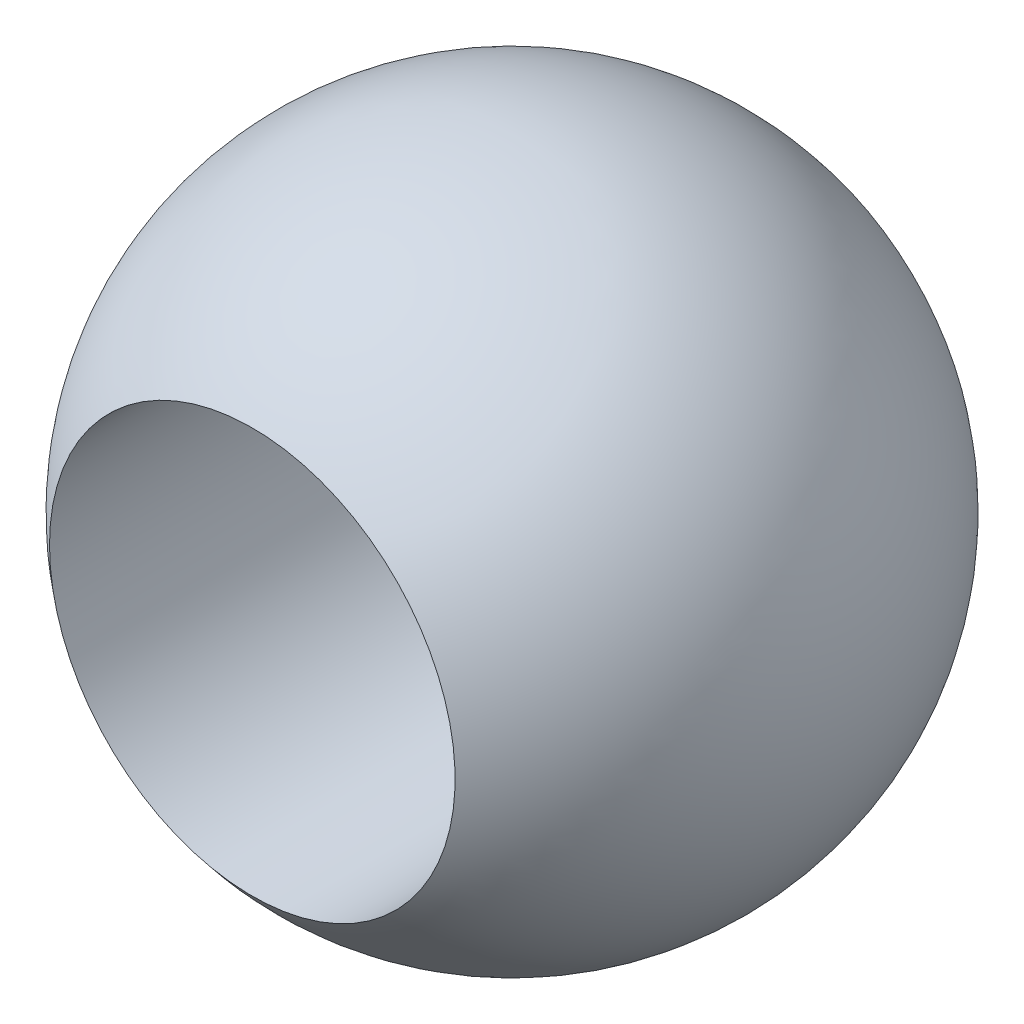
ISO-10303-21;
HEADER;
FILE_DESCRIPTION(('STEP AP214'),'2;1');
FILE_NAME('part.step','',(''),(''),'','','');
FILE_SCHEMA(('AUTOMOTIVE_DESIGN { 1 0 10303 214 1 1 1 1 }'));
ENDSEC;
DATA;
#1=APPLICATION_CONTEXT('core data for automotive mechanical design processes');
#2=APPLICATION_PROTOCOL_DEFINITION('international standard','automotive_design',2000,#1);
#3=PRODUCT_CONTEXT('',#1,'mechanical');
#4=PRODUCT('Part','Part','',(#3));
#5=PRODUCT_RELATED_PRODUCT_CATEGORY('part','',(#4));
#6=PRODUCT_DEFINITION_FORMATION('','',#4);
#7=PRODUCT_DEFINITION_CONTEXT('part definition',#1,'design');
#8=PRODUCT_DEFINITION('design','',#6,#7);
#9=PRODUCT_DEFINITION_SHAPE('','',#8);
#10=(LENGTH_UNIT() NAMED_UNIT(*) SI_UNIT(.MILLI.,.METRE.));
#11=(NAMED_UNIT(*) PLANE_ANGLE_UNIT() SI_UNIT($,.RADIAN.));
#12=(NAMED_UNIT(*) SI_UNIT($,.STERADIAN.) SOLID_ANGLE_UNIT());
#13=UNCERTAINTY_MEASURE_WITH_UNIT(LENGTH_MEASURE(1.E-05),#10,'distance_accuracy_value','');
#14=(GEOMETRIC_REPRESENTATION_CONTEXT(3) GLOBAL_UNCERTAINTY_ASSIGNED_CONTEXT((#13)) GLOBAL_UNIT_ASSIGNED_CONTEXT((#10,
#11,#12)) REPRESENTATION_CONTEXT('',''));
#15=CARTESIAN_POINT('',(0.,0.,0.));
#16=DIRECTION('',(0.,0.,1.));
#17=DIRECTION('',(1.,0.,0.));
#18=AXIS2_PLACEMENT_3D('',#15,#16,#17);
#19=CARTESIAN_POINT('',(0.,0.,0.));
#20=DIRECTION('',(-1.,0.,0.));
#21=DIRECTION('',(0.,1.,0.));
#22=AXIS2_PLACEMENT_3D('',#19,#20,#21);
#23=SPHERICAL_SURFACE('',#22,6.5);
#24=CARTESIAN_POINT('',(0.,0.,0.));
#25=DIRECTION('',(0.,0.,-1.));
#26=DIRECTION('',(-1.,0.,0.));
#27=AXIS2_PLACEMENT_3D('',#24,#25,#26);
#28=SPHERICAL_SURFACE('',#27,6.5);
#29=CARTESIAN_POINT('',(0.,0.,5.1234753829798));
#30=DIRECTION('',(0.,0.,-1.));
#31=DIRECTION('',(-1.,0.,0.));
#32=AXIS2_PLACEMENT_3D('',#29,#30,#31);
#33=CIRCLE('',#32,4.);
#34=CARTESIAN_POINT('',(-4.,0.,5.1234753829798));
#35=VERTEX_POINT('',#34);
#36=EDGE_CURVE('E10',#35,#35,#33,.F.);
#37=ORIENTED_EDGE('',*,*,#36,.F.);
#38=EDGE_LOOP('',(#37));
#39=FACE_BOUND('',#38,.T.);
#40=CARTESIAN_POINT('',(0.,0.,-5.1234753829798));
#41=DIRECTION('',(0.,0.,1.));
#42=DIRECTION('',(1.,0.,0.));
#43=AXIS2_PLACEMENT_3D('',#40,#41,#42);
#44=CIRCLE('',#43,4.);
#45=CARTESIAN_POINT('',(4.,0.,-5.1234753829798));
#46=VERTEX_POINT('',#45);
#47=EDGE_CURVE('E36',#46,#46,#44,.F.);
#48=ORIENTED_EDGE('',*,*,#47,.F.);
#49=EDGE_LOOP('',(#48));
#50=FACE_BOUND('',#49,.T.);
#51=ADVANCED_FACE('F30',(#39,#50),#28,.T.);
#52=CARTESIAN_POINT('',(0.,0.,-15.));
#53=DIRECTION('',(0.,0.,1.));
#54=DIRECTION('',(1.,0.,0.));
#55=AXIS2_PLACEMENT_3D('',#52,#53,#54);
#56=CYLINDRICAL_SURFACE('',#55,4.);
#57=ORIENTED_EDGE('',*,*,#36,.T.);
#58=EDGE_LOOP('',(#57));
#59=FACE_BOUND('',#58,.T.);
#60=ORIENTED_EDGE('',*,*,#47,.T.);
#61=EDGE_LOOP('',(#60));
#62=FACE_BOUND('',#61,.T.);
#63=ADVANCED_FACE('F42',(#59,#62),#56,.F.);
#64=CLOSED_SHELL('',(#51,#63));
#65=MANIFOLD_SOLID_BREP('B2',#64);
#66=ADVANCED_BREP_SHAPE_REPRESENTATION('',(#18,#65),#14);
#67=SHAPE_DEFINITION_REPRESENTATION(#9,#66);
ENDSEC;
END-ISO-10303-21;
